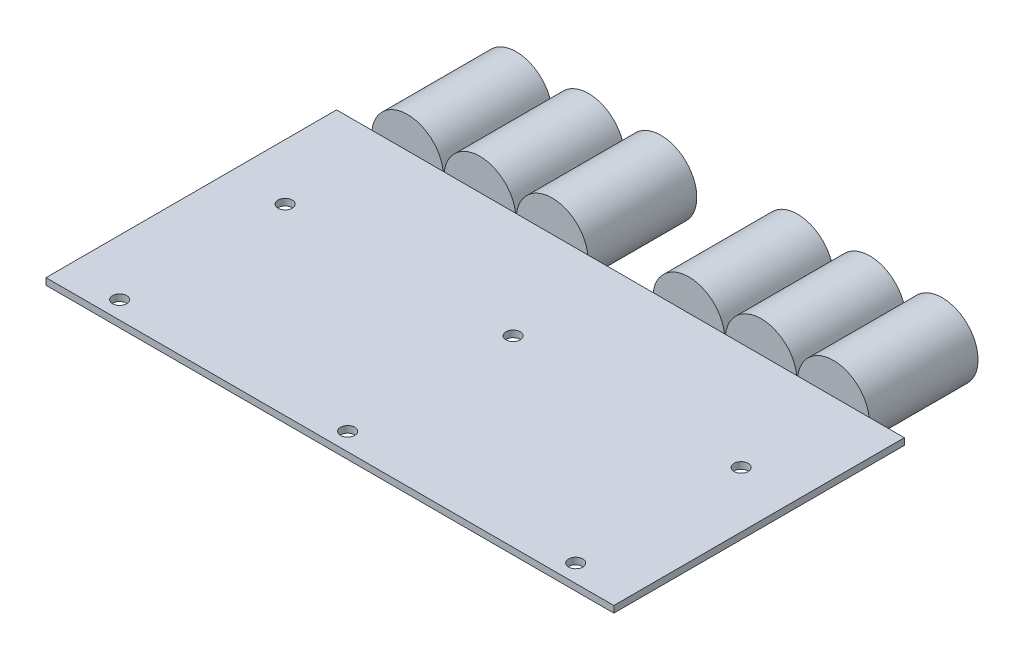
ISO-10303-21;
HEADER;
FILE_DESCRIPTION(('STEP AP214'),'2;1');
FILE_NAME('part.step','',(''),(''),'','','');
FILE_SCHEMA(('AUTOMOTIVE_DESIGN { 1 0 10303 214 1 1 1 1 }'));
ENDSEC;
DATA;
#1=APPLICATION_CONTEXT('core data for automotive mechanical design processes');
#2=APPLICATION_PROTOCOL_DEFINITION('international standard','automotive_design',2000,#1);
#3=PRODUCT_CONTEXT('',#1,'mechanical');
#4=PRODUCT('Part','Part','',(#3));
#5=PRODUCT_RELATED_PRODUCT_CATEGORY('part','',(#4));
#6=PRODUCT_DEFINITION_FORMATION('','',#4);
#7=PRODUCT_DEFINITION_CONTEXT('part definition',#1,'design');
#8=PRODUCT_DEFINITION('design','',#6,#7);
#9=PRODUCT_DEFINITION_SHAPE('','',#8);
#10=(LENGTH_UNIT() NAMED_UNIT(*) SI_UNIT(.MILLI.,.METRE.));
#11=(NAMED_UNIT(*) PLANE_ANGLE_UNIT() SI_UNIT($,.RADIAN.));
#12=(NAMED_UNIT(*) SI_UNIT($,.STERADIAN.) SOLID_ANGLE_UNIT());
#13=UNCERTAINTY_MEASURE_WITH_UNIT(LENGTH_MEASURE(1.E-05),#10,'distance_accuracy_value','');
#14=(GEOMETRIC_REPRESENTATION_CONTEXT(3) GLOBAL_UNCERTAINTY_ASSIGNED_CONTEXT((#13)) GLOBAL_UNIT_ASSIGNED_CONTEXT((#10,
#11,#12)) REPRESENTATION_CONTEXT('',''));
#15=CARTESIAN_POINT('',(0.,0.,0.));
#16=DIRECTION('',(0.,0.,1.));
#17=DIRECTION('',(1.,0.,0.));
#18=AXIS2_PLACEMENT_3D('',#15,#16,#17);
#19=CARTESIAN_POINT('',(64.,1.5,-32.75));
#20=DIRECTION('',(0.,0.,1.));
#21=DIRECTION('',(1.,0.,0.));
#22=AXIS2_PLACEMENT_3D('',#19,#20,#21);
#23=PLANE('',#22);
#24=CARTESIAN_POINT('',(-48.,0.500000000000001,-32.75));
#25=DIRECTION('',(0.,0.,-1.));
#26=DIRECTION('',(1.,0.,0.));
#27=AXIS2_PLACEMENT_3D('',#24,#25,#26);
#28=CIRCLE('',#27,8.1);
#29=CARTESIAN_POINT('',(-56.0845531725631,0.,-32.75));
#30=VERTEX_POINT('',#29);
#31=CARTESIAN_POINT('',(-56.0380345856434,1.5,-32.75));
#32=VERTEX_POINT('',#31);
#33=EDGE_CURVE('E55',#30,#32,#28,.T.);
#34=ORIENTED_EDGE('',*,*,#33,.F.);
#35=DIRECTION('',(-1.,0.,0.));
#36=VECTOR('',#35,1.);
#37=CARTESIAN_POINT('',(64.,0.,-32.75));
#38=LINE('',#37,#36);
#39=CARTESIAN_POINT('',(-64.,0.,-32.75));
#40=VERTEX_POINT('',#39);
#41=EDGE_CURVE('E203',#30,#40,#38,.T.);
#42=ORIENTED_EDGE('',*,*,#41,.T.);
#43=DIRECTION('',(0.,-1.,0.));
#44=VECTOR('',#43,1.);
#45=CARTESIAN_POINT('',(-64.,1.5,-32.75));
#46=LINE('',#45,#44);
#47=CARTESIAN_POINT('',(-64.,1.5,-32.75));
#48=VERTEX_POINT('',#47);
#49=EDGE_CURVE('E219',#48,#40,#46,.T.);
#50=ORIENTED_EDGE('',*,*,#49,.F.);
#51=DIRECTION('',(-1.,0.,0.));
#52=VECTOR('',#51,1.);
#53=CARTESIAN_POINT('',(64.,1.5,-32.75));
#54=LINE('',#53,#52);
#55=EDGE_CURVE('E350',#32,#48,#54,.T.);
#56=ORIENTED_EDGE('',*,*,#55,.F.);
#57=EDGE_LOOP('',(#34,#42,#50,#56));
#58=FACE_BOUND('',#57,.T.);
#59=ADVANCED_FACE('F37',(#58),#23,.F.);
#60=CARTESIAN_POINT('',(-39.9619654143566,1.5,-32.75));
#61=VERTEX_POINT('',#60);
#62=CARTESIAN_POINT('',(-39.9154468274369,0.,-32.75));
#63=VERTEX_POINT('',#62);
#64=EDGE_CURVE('E179',#61,#63,#28,.T.);
#65=ORIENTED_EDGE('',*,*,#64,.F.);
#66=CARTESIAN_POINT('',(-39.7380345856434,1.5,-32.75));
#67=VERTEX_POINT('',#66);
#68=EDGE_CURVE('E401',#67,#61,#54,.T.);
#69=ORIENTED_EDGE('',*,*,#68,.F.);
#70=CARTESIAN_POINT('',(-31.7,0.500000000000001,-32.75));
#71=DIRECTION('',(0.,0.,-1.));
#72=DIRECTION('',(1.,0.,0.));
#73=AXIS2_PLACEMENT_3D('',#70,#71,#72);
#74=CIRCLE('',#73,8.1);
#75=CARTESIAN_POINT('',(-39.7845531725631,0.,-32.75));
#76=VERTEX_POINT('',#75);
#77=EDGE_CURVE('E63',#76,#67,#74,.T.);
#78=ORIENTED_EDGE('',*,*,#77,.F.);
#79=EDGE_CURVE('E202',#76,#63,#38,.T.);
#80=ORIENTED_EDGE('',*,*,#79,.T.);
#81=EDGE_LOOP('',(#65,#69,#78,#80));
#82=FACE_BOUND('',#81,.T.);
#83=ADVANCED_FACE('F206',(#82),#23,.F.);
#84=CARTESIAN_POINT('',(-23.6619654143566,1.5,-32.75));
#85=VERTEX_POINT('',#84);
#86=CARTESIAN_POINT('',(-23.6154468274369,0.,-32.75));
#87=VERTEX_POINT('',#86);
#88=EDGE_CURVE('E204',#85,#87,#74,.T.);
#89=ORIENTED_EDGE('',*,*,#88,.F.);
#90=CARTESIAN_POINT('',(-23.4380345856434,1.5,-32.75));
#91=VERTEX_POINT('',#90);
#92=EDGE_CURVE('E391',#91,#85,#54,.T.);
#93=ORIENTED_EDGE('',*,*,#92,.F.);
#94=CARTESIAN_POINT('',(-15.4,0.500000000000001,-32.75));
#95=DIRECTION('',(0.,0.,-1.));
#96=DIRECTION('',(1.,0.,0.));
#97=AXIS2_PLACEMENT_3D('',#94,#95,#96);
#98=CIRCLE('',#97,8.1);
#99=CARTESIAN_POINT('',(-23.4845531725631,0.,-32.75));
#100=VERTEX_POINT('',#99);
#101=EDGE_CURVE('E280',#100,#91,#98,.T.);
#102=ORIENTED_EDGE('',*,*,#101,.F.);
#103=EDGE_CURVE('E207',#100,#87,#38,.T.);
#104=ORIENTED_EDGE('',*,*,#103,.T.);
#105=EDGE_LOOP('',(#89,#93,#102,#104));
#106=FACE_BOUND('',#105,.T.);
#107=ADVANCED_FACE('F311',(#106),#23,.F.);
#108=CARTESIAN_POINT('',(-7.36196541435657,1.5,-32.75));
#109=VERTEX_POINT('',#108);
#110=CARTESIAN_POINT('',(-7.31544682743691,0.,-32.75));
#111=VERTEX_POINT('',#110);
#112=EDGE_CURVE('E281',#109,#111,#98,.T.);
#113=ORIENTED_EDGE('',*,*,#112,.F.);
#114=CARTESIAN_POINT('',(7.36196541435656,1.5,-32.75));
#115=VERTEX_POINT('',#114);
#116=EDGE_CURVE('E397',#115,#109,#54,.T.);
#117=ORIENTED_EDGE('',*,*,#116,.F.);
#118=CARTESIAN_POINT('',(15.4,0.500000000000001,-32.75));
#119=DIRECTION('',(0.,0.,-1.));
#120=DIRECTION('',(-1.,0.,0.));
#121=AXIS2_PLACEMENT_3D('',#118,#119,#120);
#122=CIRCLE('',#121,8.1);
#123=CARTESIAN_POINT('',(7.3154468274369,0.,-32.75));
#124=VERTEX_POINT('',#123);
#125=EDGE_CURVE('E271',#124,#115,#122,.T.);
#126=ORIENTED_EDGE('',*,*,#125,.F.);
#127=EDGE_CURVE('E210',#124,#111,#38,.T.);
#128=ORIENTED_EDGE('',*,*,#127,.T.);
#129=EDGE_LOOP('',(#113,#117,#126,#128));
#130=FACE_BOUND('',#129,.T.);
#131=ADVANCED_FACE('F336',(#130),#23,.F.);
#132=CARTESIAN_POINT('',(23.4380345856434,1.5,-32.75));
#133=VERTEX_POINT('',#132);
#134=CARTESIAN_POINT('',(23.4845531725631,0.,-32.75));
#135=VERTEX_POINT('',#134);
#136=EDGE_CURVE('E270',#133,#135,#122,.T.);
#137=ORIENTED_EDGE('',*,*,#136,.F.);
#138=CARTESIAN_POINT('',(23.6619654143566,1.5,-32.75));
#139=VERTEX_POINT('',#138);
#140=EDGE_CURVE('E851',#139,#133,#54,.T.);
#141=ORIENTED_EDGE('',*,*,#140,.F.);
#142=CARTESIAN_POINT('',(31.7,0.500000000000001,-32.75));
#143=DIRECTION('',(0.,0.,-1.));
#144=DIRECTION('',(-1.,0.,0.));
#145=AXIS2_PLACEMENT_3D('',#142,#143,#144);
#146=CIRCLE('',#145,8.1);
#147=CARTESIAN_POINT('',(23.6154468274369,0.,-32.75));
#148=VERTEX_POINT('',#147);
#149=EDGE_CURVE('E260',#148,#139,#146,.T.);
#150=ORIENTED_EDGE('',*,*,#149,.F.);
#151=EDGE_CURVE('E364',#148,#135,#38,.T.);
#152=ORIENTED_EDGE('',*,*,#151,.T.);
#153=EDGE_LOOP('',(#137,#141,#150,#152));
#154=FACE_BOUND('',#153,.T.);
#155=ADVANCED_FACE('F329',(#154),#23,.F.);
#156=CARTESIAN_POINT('',(48.,0.500000000000001,-32.75));
#157=DIRECTION('',(0.,0.,-1.));
#158=DIRECTION('',(-1.,0.,0.));
#159=AXIS2_PLACEMENT_3D('',#156,#157,#158);
#160=CIRCLE('',#159,8.1);
#161=CARTESIAN_POINT('',(56.0380345856434,1.5,-32.75));
#162=VERTEX_POINT('',#161);
#163=CARTESIAN_POINT('',(56.0845531725631,0.,-32.75));
#164=VERTEX_POINT('',#163);
#165=EDGE_CURVE('E12',#162,#164,#160,.T.);
#166=ORIENTED_EDGE('',*,*,#165,.F.);
#167=CARTESIAN_POINT('',(64.,1.5,-32.75));
#168=VERTEX_POINT('',#167);
#169=EDGE_CURVE('E223',#168,#162,#54,.T.);
#170=ORIENTED_EDGE('',*,*,#169,.F.);
#171=DIRECTION('',(0.,-1.,0.));
#172=VECTOR('',#171,1.);
#173=CARTESIAN_POINT('',(64.,1.5,-32.75));
#174=LINE('',#173,#172);
#175=CARTESIAN_POINT('',(64.,0.,-32.75));
#176=VERTEX_POINT('',#175);
#177=EDGE_CURVE('E222',#168,#176,#174,.T.);
#178=ORIENTED_EDGE('',*,*,#177,.T.);
#179=EDGE_CURVE('E212',#176,#164,#38,.T.);
#180=ORIENTED_EDGE('',*,*,#179,.T.);
#181=EDGE_LOOP('',(#166,#170,#178,#180));
#182=FACE_BOUND('',#181,.T.);
#183=ADVANCED_FACE('F318',(#182),#23,.F.);
#184=CARTESIAN_POINT('',(0.,0.,0.));
#185=DIRECTION('',(0.,-1.,0.));
#186=DIRECTION('',(0.,0.,-1.));
#187=AXIS2_PLACEMENT_3D('',#184,#185,#186);
#188=PLANE('',#187);
#189=CARTESIAN_POINT('',(0.,0.,28.75));
#190=DIRECTION('',(0.,1.,0.));
#191=DIRECTION('',(0.,0.,1.));
#192=AXIS2_PLACEMENT_3D('',#189,#190,#191);
#193=CIRCLE('',#192,1.6);
#194=CARTESIAN_POINT('',(0.,0.,30.35));
#195=VERTEX_POINT('',#194);
#196=EDGE_CURVE('E434',#195,#195,#193,.T.);
#197=ORIENTED_EDGE('',*,*,#196,.T.);
#198=EDGE_LOOP('',(#197));
#199=FACE_BOUND('',#198,.T.);
#200=CARTESIAN_POINT('',(51.4,0.,28.75));
#201=DIRECTION('',(0.,1.,0.));
#202=DIRECTION('',(0.,0.,1.));
#203=AXIS2_PLACEMENT_3D('',#200,#201,#202);
#204=CIRCLE('',#203,1.6);
#205=CARTESIAN_POINT('',(51.4,0.,30.35));
#206=VERTEX_POINT('',#205);
#207=EDGE_CURVE('E428',#206,#206,#204,.T.);
#208=ORIENTED_EDGE('',*,*,#207,.T.);
#209=EDGE_LOOP('',(#208));
#210=FACE_BOUND('',#209,.T.);
#211=CARTESIAN_POINT('',(-51.4,0.,-8.54999999999998));
#212=DIRECTION('',(0.,1.,0.));
#213=DIRECTION('',(0.,0.,1.));
#214=AXIS2_PLACEMENT_3D('',#211,#212,#213);
#215=CIRCLE('',#214,1.6);
#216=CARTESIAN_POINT('',(-51.4,0.,-6.94999999999998));
#217=VERTEX_POINT('',#216);
#218=EDGE_CURVE('E422',#217,#217,#215,.T.);
#219=ORIENTED_EDGE('',*,*,#218,.T.);
#220=EDGE_LOOP('',(#219));
#221=FACE_BOUND('',#220,.T.);
#222=CARTESIAN_POINT('',(0.,0.,-8.54999999999998));
#223=DIRECTION('',(0.,1.,0.));
#224=DIRECTION('',(0.,0.,1.));
#225=AXIS2_PLACEMENT_3D('',#222,#223,#224);
#226=CIRCLE('',#225,1.6);
#227=CARTESIAN_POINT('',(0.,0.,-6.94999999999998));
#228=VERTEX_POINT('',#227);
#229=EDGE_CURVE('E415',#228,#228,#226,.T.);
#230=ORIENTED_EDGE('',*,*,#229,.T.);
#231=EDGE_LOOP('',(#230));
#232=FACE_BOUND('',#231,.T.);
#233=CARTESIAN_POINT('',(51.4,0.,-8.54999999999999));
#234=DIRECTION('',(0.,1.,0.));
#235=DIRECTION('',(0.,0.,1.));
#236=AXIS2_PLACEMENT_3D('',#233,#234,#235);
#237=CIRCLE('',#236,1.6);
#238=CARTESIAN_POINT('',(51.4,0.,-6.94999999999999));
#239=VERTEX_POINT('',#238);
#240=EDGE_CURVE('E439',#239,#239,#237,.T.);
#241=ORIENTED_EDGE('',*,*,#240,.T.);
#242=EDGE_LOOP('',(#241));
#243=FACE_BOUND('',#242,.T.);
#244=CARTESIAN_POINT('',(-51.4,0.,28.75));
#245=DIRECTION('',(0.,1.,0.));
#246=DIRECTION('',(0.,0.,1.));
#247=AXIS2_PLACEMENT_3D('',#244,#245,#246);
#248=CIRCLE('',#247,1.6);
#249=CARTESIAN_POINT('',(-51.4,0.,30.35));
#250=VERTEX_POINT('',#249);
#251=EDGE_CURVE('E409',#250,#250,#248,.T.);
#252=ORIENTED_EDGE('',*,*,#251,.T.);
#253=EDGE_LOOP('',(#252));
#254=FACE_BOUND('',#253,.T.);
#255=DIRECTION('',(0.,0.,1.));
#256=VECTOR('',#255,1.);
#257=CARTESIAN_POINT('',(-64.,0.,-32.75));
#258=LINE('',#257,#256);
#259=CARTESIAN_POINT('',(-64.,0.,32.75));
#260=VERTEX_POINT('',#259);
#261=EDGE_CURVE('E358',#40,#260,#258,.T.);
#262=ORIENTED_EDGE('',*,*,#261,.F.);
#263=ORIENTED_EDGE('',*,*,#41,.F.);
#264=DIRECTION('',(-1.,0.,0.));
#265=VECTOR('',#264,1.);
#266=CARTESIAN_POINT('',(0.,0.,-32.75));
#267=LINE('',#266,#265);
#268=EDGE_CURVE('E193',#63,#30,#267,.T.);
#269=ORIENTED_EDGE('',*,*,#268,.F.);
#270=ORIENTED_EDGE('',*,*,#79,.F.);
#271=DIRECTION('',(-1.,0.,0.));
#272=VECTOR('',#271,1.);
#273=CARTESIAN_POINT('',(0.,0.,-32.75));
#274=LINE('',#273,#272);
#275=EDGE_CURVE('E282',#87,#76,#274,.T.);
#276=ORIENTED_EDGE('',*,*,#275,.F.);
#277=ORIENTED_EDGE('',*,*,#103,.F.);
#278=DIRECTION('',(-1.,0.,0.));
#279=VECTOR('',#278,1.);
#280=CARTESIAN_POINT('',(0.,0.,-32.75));
#281=LINE('',#280,#279);
#282=EDGE_CURVE('E272',#111,#100,#281,.T.);
#283=ORIENTED_EDGE('',*,*,#282,.F.);
#284=ORIENTED_EDGE('',*,*,#127,.F.);
#285=DIRECTION('',(1.,0.,0.));
#286=VECTOR('',#285,1.);
#287=CARTESIAN_POINT('',(0.,0.,-32.75));
#288=LINE('',#287,#286);
#289=EDGE_CURVE('E261',#124,#135,#288,.T.);
#290=ORIENTED_EDGE('',*,*,#289,.T.);
#291=ORIENTED_EDGE('',*,*,#151,.F.);
#292=DIRECTION('',(1.,0.,0.));
#293=VECTOR('',#292,1.);
#294=CARTESIAN_POINT('',(0.,0.,-32.75));
#295=LINE('',#294,#293);
#296=CARTESIAN_POINT('',(39.7845531725631,0.,-32.75));
#297=VERTEX_POINT('',#296);
#298=EDGE_CURVE('E246',#148,#297,#295,.T.);
#299=ORIENTED_EDGE('',*,*,#298,.T.);
#300=CARTESIAN_POINT('',(39.9154468274369,0.,-32.75));
#301=VERTEX_POINT('',#300);
#302=EDGE_CURVE('E362',#301,#297,#38,.T.);
#303=ORIENTED_EDGE('',*,*,#302,.F.);
#304=EDGE_CURVE('E217',#164,#301,#38,.T.);
#305=ORIENTED_EDGE('',*,*,#304,.F.);
#306=ORIENTED_EDGE('',*,*,#179,.F.);
#307=DIRECTION('',(0.,0.,-1.));
#308=VECTOR('',#307,1.);
#309=CARTESIAN_POINT('',(64.,0.,-32.75));
#310=LINE('',#309,#308);
#311=CARTESIAN_POINT('',(64.,0.,32.75));
#312=VERTEX_POINT('',#311);
#313=EDGE_CURVE('E211',#312,#176,#310,.T.);
#314=ORIENTED_EDGE('',*,*,#313,.F.);
#315=DIRECTION('',(1.,0.,0.));
#316=VECTOR('',#315,1.);
#317=CARTESIAN_POINT('',(64.,0.,32.75));
#318=LINE('',#317,#316);
#319=EDGE_CURVE('E359',#260,#312,#318,.T.);
#320=ORIENTED_EDGE('',*,*,#319,.F.);
#321=EDGE_LOOP('',(#262,#263,#269,#270,#276,#277,#283,#284,#290,#291,#299,#303,#305,#306,#314,#320));
#322=FACE_BOUND('',#321,.T.);
#323=DIRECTION('',(1.,0.,0.));
#324=VECTOR('',#323,1.);
#325=CARTESIAN_POINT('',(52.5,0.,1.75000000000002));
#326=LINE('',#325,#324);
#327=CARTESIAN_POINT('',(-52.5,0.,1.75000000000001));
#328=VERTEX_POINT('',#327);
#329=CARTESIAN_POINT('',(52.5,0.,1.75000000000002));
#330=VERTEX_POINT('',#329);
#331=EDGE_CURVE('E461',#328,#330,#326,.T.);
#332=ORIENTED_EDGE('',*,*,#331,.F.);
#333=DIRECTION('',(0.,0.,-1.));
#334=VECTOR('',#333,1.);
#335=CARTESIAN_POINT('',(-52.5,0.,1.75000000000001));
#336=LINE('',#335,#334);
#337=CARTESIAN_POINT('',(-52.5,0.,19.75));
#338=VERTEX_POINT('',#337);
#339=EDGE_CURVE('E245',#338,#328,#336,.T.);
#340=ORIENTED_EDGE('',*,*,#339,.F.);
#341=DIRECTION('',(-1.,0.,0.));
#342=VECTOR('',#341,1.);
#343=CARTESIAN_POINT('',(52.5,0.,19.75));
#344=LINE('',#343,#342);
#345=CARTESIAN_POINT('',(52.5,0.,19.75));
#346=VERTEX_POINT('',#345);
#347=EDGE_CURVE('E455',#346,#338,#344,.T.);
#348=ORIENTED_EDGE('',*,*,#347,.F.);
#349=DIRECTION('',(0.,0.,1.));
#350=VECTOR('',#349,1.);
#351=CARTESIAN_POINT('',(52.5,0.,1.75000000000002));
#352=LINE('',#351,#350);
#353=EDGE_CURVE('E458',#330,#346,#352,.T.);
#354=ORIENTED_EDGE('',*,*,#353,.F.);
#355=EDGE_LOOP('',(#332,#340,#348,#354));
#356=FACE_BOUND('',#355,.T.);
#357=ADVANCED_FACE('F199',(#199,#210,#221,#232,#243,#254,#322,#356),#188,.T.);
#358=CARTESIAN_POINT('',(-64.,1.5,-32.75));
#359=DIRECTION('',(1.,0.,0.));
#360=DIRECTION('',(0.,0.,-1.));
#361=AXIS2_PLACEMENT_3D('',#358,#359,#360);
#362=PLANE('',#361);
#363=ORIENTED_EDGE('',*,*,#261,.T.);
#364=DIRECTION('',(0.,-1.,0.));
#365=VECTOR('',#364,1.);
#366=CARTESIAN_POINT('',(-64.,1.5,32.75));
#367=LINE('',#366,#365);
#368=CARTESIAN_POINT('',(-64.,1.5,32.75));
#369=VERTEX_POINT('',#368);
#370=EDGE_CURVE('E41',#369,#260,#367,.T.);
#371=ORIENTED_EDGE('',*,*,#370,.F.);
#372=DIRECTION('',(0.,0.,1.));
#373=VECTOR('',#372,1.);
#374=CARTESIAN_POINT('',(-64.,1.5,-32.75));
#375=LINE('',#374,#373);
#376=EDGE_CURVE('E216',#48,#369,#375,.T.);
#377=ORIENTED_EDGE('',*,*,#376,.F.);
#378=ORIENTED_EDGE('',*,*,#49,.T.);
#379=EDGE_LOOP('',(#363,#371,#377,#378));
#380=FACE_BOUND('',#379,.T.);
#381=ADVANCED_FACE('F39',(#380),#362,.F.);
#382=CARTESIAN_POINT('',(64.,1.5,32.75));
#383=DIRECTION('',(0.,0.,-1.));
#384=DIRECTION('',(-1.,0.,0.));
#385=AXIS2_PLACEMENT_3D('',#382,#383,#384);
#386=PLANE('',#385);
#387=ORIENTED_EDGE('',*,*,#319,.T.);
#388=DIRECTION('',(0.,-1.,0.));
#389=VECTOR('',#388,1.);
#390=CARTESIAN_POINT('',(64.,1.5,32.75));
#391=LINE('',#390,#389);
#392=CARTESIAN_POINT('',(64.,1.5,32.75));
#393=VERTEX_POINT('',#392);
#394=EDGE_CURVE('E225',#393,#312,#391,.T.);
#395=ORIENTED_EDGE('',*,*,#394,.F.);
#396=DIRECTION('',(1.,0.,0.));
#397=VECTOR('',#396,1.);
#398=CARTESIAN_POINT('',(64.,1.5,32.75));
#399=LINE('',#398,#397);
#400=EDGE_CURVE('E406',#369,#393,#399,.T.);
#401=ORIENTED_EDGE('',*,*,#400,.F.);
#402=ORIENTED_EDGE('',*,*,#370,.T.);
#403=EDGE_LOOP('',(#387,#395,#401,#402));
#404=FACE_BOUND('',#403,.T.);
#405=ADVANCED_FACE('F326',(#404),#386,.F.);
#406=CARTESIAN_POINT('',(64.,1.5,-32.75));
#407=DIRECTION('',(-1.,0.,0.));
#408=DIRECTION('',(0.,0.,1.));
#409=AXIS2_PLACEMENT_3D('',#406,#407,#408);
#410=PLANE('',#409);
#411=ORIENTED_EDGE('',*,*,#313,.T.);
#412=ORIENTED_EDGE('',*,*,#177,.F.);
#413=DIRECTION('',(0.,0.,-1.));
#414=VECTOR('',#413,1.);
#415=CARTESIAN_POINT('',(64.,1.5,-32.75));
#416=LINE('',#415,#414);
#417=EDGE_CURVE('E347',#393,#168,#416,.T.);
#418=ORIENTED_EDGE('',*,*,#417,.F.);
#419=ORIENTED_EDGE('',*,*,#394,.T.);
#420=EDGE_LOOP('',(#411,#412,#418,#419));
#421=FACE_BOUND('',#420,.T.);
#422=ADVANCED_FACE('F316',(#421),#410,.F.);
#423=CARTESIAN_POINT('',(39.7380345856434,1.5,-32.75));
#424=VERTEX_POINT('',#423);
#425=EDGE_CURVE('E259',#424,#297,#146,.T.);
#426=ORIENTED_EDGE('',*,*,#425,.F.);
#427=CARTESIAN_POINT('',(39.9619654143566,1.5,-32.75));
#428=VERTEX_POINT('',#427);
#429=EDGE_CURVE('E353',#428,#424,#54,.T.);
#430=ORIENTED_EDGE('',*,*,#429,.F.);
#431=EDGE_CURVE('E46',#301,#428,#160,.T.);
#432=ORIENTED_EDGE('',*,*,#431,.F.);
#433=ORIENTED_EDGE('',*,*,#302,.T.);
#434=EDGE_LOOP('',(#426,#430,#432,#433));
#435=FACE_BOUND('',#434,.T.);
#436=ADVANCED_FACE('F307',(#435),#23,.F.);
#437=CARTESIAN_POINT('',(0.,1.5,0.));
#438=DIRECTION('',(0.,-1.,0.));
#439=DIRECTION('',(0.,0.,-1.));
#440=AXIS2_PLACEMENT_3D('',#437,#438,#439);
#441=PLANE('',#440);
#442=CARTESIAN_POINT('',(0.,1.5,28.75));
#443=DIRECTION('',(0.,1.,0.));
#444=DIRECTION('',(0.,0.,1.));
#445=AXIS2_PLACEMENT_3D('',#442,#443,#444);
#446=CIRCLE('',#445,1.6);
#447=CARTESIAN_POINT('',(0.,1.5,30.35));
#448=VERTEX_POINT('',#447);
#449=EDGE_CURVE('E412',#448,#448,#446,.T.);
#450=ORIENTED_EDGE('',*,*,#449,.F.);
#451=EDGE_LOOP('',(#450));
#452=FACE_BOUND('',#451,.T.);
#453=CARTESIAN_POINT('',(51.4,1.5,28.75));
#454=DIRECTION('',(0.,1.,0.));
#455=DIRECTION('',(0.,0.,1.));
#456=AXIS2_PLACEMENT_3D('',#453,#454,#455);
#457=CIRCLE('',#456,1.6);
#458=CARTESIAN_POINT('',(51.4,1.5,30.35));
#459=VERTEX_POINT('',#458);
#460=EDGE_CURVE('E431',#459,#459,#457,.T.);
#461=ORIENTED_EDGE('',*,*,#460,.F.);
#462=EDGE_LOOP('',(#461));
#463=FACE_BOUND('',#462,.T.);
#464=CARTESIAN_POINT('',(-51.4,1.5,-8.54999999999998));
#465=DIRECTION('',(0.,1.,0.));
#466=DIRECTION('',(0.,0.,1.));
#467=AXIS2_PLACEMENT_3D('',#464,#465,#466);
#468=CIRCLE('',#467,1.6);
#469=CARTESIAN_POINT('',(-51.4,1.5,-6.94999999999998));
#470=VERTEX_POINT('',#469);
#471=EDGE_CURVE('E425',#470,#470,#468,.T.);
#472=ORIENTED_EDGE('',*,*,#471,.F.);
#473=EDGE_LOOP('',(#472));
#474=FACE_BOUND('',#473,.T.);
#475=CARTESIAN_POINT('',(0.,1.5,-8.54999999999998));
#476=DIRECTION('',(0.,1.,0.));
#477=DIRECTION('',(0.,0.,1.));
#478=AXIS2_PLACEMENT_3D('',#475,#476,#477);
#479=CIRCLE('',#478,1.6);
#480=CARTESIAN_POINT('',(0.,1.5,-6.94999999999998));
#481=VERTEX_POINT('',#480);
#482=EDGE_CURVE('E418',#481,#481,#479,.T.);
#483=ORIENTED_EDGE('',*,*,#482,.F.);
#484=EDGE_LOOP('',(#483));
#485=FACE_BOUND('',#484,.T.);
#486=CARTESIAN_POINT('',(51.4,1.5,-8.54999999999999));
#487=DIRECTION('',(0.,1.,0.));
#488=DIRECTION('',(0.,0.,1.));
#489=AXIS2_PLACEMENT_3D('',#486,#487,#488);
#490=CIRCLE('',#489,1.6);
#491=CARTESIAN_POINT('',(51.4,1.5,-6.94999999999999));
#492=VERTEX_POINT('',#491);
#493=EDGE_CURVE('E419',#492,#492,#490,.T.);
#494=ORIENTED_EDGE('',*,*,#493,.F.);
#495=EDGE_LOOP('',(#494));
#496=FACE_BOUND('',#495,.T.);
#497=CARTESIAN_POINT('',(-51.4,1.5,28.75));
#498=DIRECTION('',(0.,1.,0.));
#499=DIRECTION('',(0.,0.,1.));
#500=AXIS2_PLACEMENT_3D('',#497,#498,#499);
#501=CIRCLE('',#500,1.6);
#502=CARTESIAN_POINT('',(-51.4,1.5,30.35));
#503=VERTEX_POINT('',#502);
#504=EDGE_CURVE('E360',#503,#503,#501,.T.);
#505=ORIENTED_EDGE('',*,*,#504,.F.);
#506=EDGE_LOOP('',(#505));
#507=FACE_BOUND('',#506,.T.);
#508=ORIENTED_EDGE('',*,*,#376,.T.);
#509=ORIENTED_EDGE('',*,*,#400,.T.);
#510=ORIENTED_EDGE('',*,*,#417,.T.);
#511=ORIENTED_EDGE('',*,*,#169,.T.);
#512=EDGE_CURVE('E345',#162,#428,#54,.T.);
#513=ORIENTED_EDGE('',*,*,#512,.T.);
#514=ORIENTED_EDGE('',*,*,#429,.T.);
#515=EDGE_CURVE('E354',#424,#139,#54,.T.);
#516=ORIENTED_EDGE('',*,*,#515,.T.);
#517=ORIENTED_EDGE('',*,*,#140,.T.);
#518=EDGE_CURVE('E398',#133,#115,#54,.T.);
#519=ORIENTED_EDGE('',*,*,#518,.T.);
#520=ORIENTED_EDGE('',*,*,#116,.T.);
#521=EDGE_CURVE('E396',#109,#91,#54,.T.);
#522=ORIENTED_EDGE('',*,*,#521,.T.);
#523=ORIENTED_EDGE('',*,*,#92,.T.);
#524=EDGE_CURVE('E399',#85,#67,#54,.T.);
#525=ORIENTED_EDGE('',*,*,#524,.T.);
#526=ORIENTED_EDGE('',*,*,#68,.T.);
#527=EDGE_CURVE('E402',#61,#32,#54,.T.);
#528=ORIENTED_EDGE('',*,*,#527,.T.);
#529=ORIENTED_EDGE('',*,*,#55,.T.);
#530=EDGE_LOOP('',(#508,#509,#510,#511,#513,#514,#516,#517,#519,#520,#522,#523,#525,#526,#528,#529));
#531=FACE_BOUND('',#530,.T.);
#532=ADVANCED_FACE('F315',(#452,#463,#474,#485,#496,#507,#531),#441,.F.);
#533=CARTESIAN_POINT('',(-51.4,1.5,28.75));
#534=DIRECTION('',(0.,-1.,0.));
#535=DIRECTION('',(0.,0.,-1.));
#536=AXIS2_PLACEMENT_3D('',#533,#534,#535);
#537=CYLINDRICAL_SURFACE('',#536,1.6);
#538=ORIENTED_EDGE('',*,*,#504,.T.);
#539=EDGE_LOOP('',(#538));
#540=FACE_BOUND('',#539,.T.);
#541=ORIENTED_EDGE('',*,*,#251,.F.);
#542=EDGE_LOOP('',(#541));
#543=FACE_BOUND('',#542,.T.);
#544=ADVANCED_FACE('F323',(#540,#543),#537,.F.);
#545=CARTESIAN_POINT('',(51.4,1.5,-8.54999999999999));
#546=DIRECTION('',(0.,-1.,0.));
#547=DIRECTION('',(0.,0.,-1.));
#548=AXIS2_PLACEMENT_3D('',#545,#546,#547);
#549=CYLINDRICAL_SURFACE('',#548,1.6);
#550=ORIENTED_EDGE('',*,*,#493,.T.);
#551=EDGE_LOOP('',(#550));
#552=FACE_BOUND('',#551,.T.);
#553=ORIENTED_EDGE('',*,*,#240,.F.);
#554=EDGE_LOOP('',(#553));
#555=FACE_BOUND('',#554,.T.);
#556=ADVANCED_FACE('F508',(#552,#555),#549,.F.);
#557=CARTESIAN_POINT('',(0.,1.5,-8.54999999999998));
#558=DIRECTION('',(0.,-1.,0.));
#559=DIRECTION('',(0.,0.,-1.));
#560=AXIS2_PLACEMENT_3D('',#557,#558,#559);
#561=CYLINDRICAL_SURFACE('',#560,1.6);
#562=ORIENTED_EDGE('',*,*,#482,.T.);
#563=EDGE_LOOP('',(#562));
#564=FACE_BOUND('',#563,.T.);
#565=ORIENTED_EDGE('',*,*,#229,.F.);
#566=EDGE_LOOP('',(#565));
#567=FACE_BOUND('',#566,.T.);
#568=ADVANCED_FACE('F511',(#564,#567),#561,.F.);
#569=CARTESIAN_POINT('',(-51.4,1.5,-8.54999999999998));
#570=DIRECTION('',(0.,-1.,0.));
#571=DIRECTION('',(0.,0.,-1.));
#572=AXIS2_PLACEMENT_3D('',#569,#570,#571);
#573=CYLINDRICAL_SURFACE('',#572,1.6);
#574=ORIENTED_EDGE('',*,*,#471,.T.);
#575=EDGE_LOOP('',(#574));
#576=FACE_BOUND('',#575,.T.);
#577=ORIENTED_EDGE('',*,*,#218,.F.);
#578=EDGE_LOOP('',(#577));
#579=FACE_BOUND('',#578,.T.);
#580=ADVANCED_FACE('F519',(#576,#579),#573,.F.);
#581=CARTESIAN_POINT('',(51.4,1.5,28.75));
#582=DIRECTION('',(0.,-1.,0.));
#583=DIRECTION('',(0.,0.,-1.));
#584=AXIS2_PLACEMENT_3D('',#581,#582,#583);
#585=CYLINDRICAL_SURFACE('',#584,1.6);
#586=ORIENTED_EDGE('',*,*,#460,.T.);
#587=EDGE_LOOP('',(#586));
#588=FACE_BOUND('',#587,.T.);
#589=ORIENTED_EDGE('',*,*,#207,.F.);
#590=EDGE_LOOP('',(#589));
#591=FACE_BOUND('',#590,.T.);
#592=ADVANCED_FACE('F515',(#588,#591),#585,.F.);
#593=CARTESIAN_POINT('',(0.,1.5,28.75));
#594=DIRECTION('',(0.,-1.,0.));
#595=DIRECTION('',(0.,0.,-1.));
#596=AXIS2_PLACEMENT_3D('',#593,#594,#595);
#597=CYLINDRICAL_SURFACE('',#596,1.6);
#598=ORIENTED_EDGE('',*,*,#449,.T.);
#599=EDGE_LOOP('',(#598));
#600=FACE_BOUND('',#599,.T.);
#601=ORIENTED_EDGE('',*,*,#196,.F.);
#602=EDGE_LOOP('',(#601));
#603=FACE_BOUND('',#602,.T.);
#604=ADVANCED_FACE('F507',(#600,#603),#597,.F.);
#605=CARTESIAN_POINT('',(-52.5,-1.,1.75000000000001));
#606=DIRECTION('',(1.,0.,0.));
#607=DIRECTION('',(0.,0.,-1.));
#608=AXIS2_PLACEMENT_3D('',#605,#606,#607);
#609=PLANE('',#608);
#610=ORIENTED_EDGE('',*,*,#339,.T.);
#611=DIRECTION('',(0.,1.,0.));
#612=VECTOR('',#611,1.);
#613=CARTESIAN_POINT('',(-52.5,-1.,1.75000000000001));
#614=LINE('',#613,#612);
#615=CARTESIAN_POINT('',(-52.5,-1.,1.75000000000001));
#616=VERTEX_POINT('',#615);
#617=EDGE_CURVE('E442',#616,#328,#614,.T.);
#618=ORIENTED_EDGE('',*,*,#617,.F.);
#619=DIRECTION('',(0.,0.,-1.));
#620=VECTOR('',#619,1.);
#621=CARTESIAN_POINT('',(-52.5,-1.,1.75000000000001));
#622=LINE('',#621,#620);
#623=CARTESIAN_POINT('',(-52.5,-1.,19.75));
#624=VERTEX_POINT('',#623);
#625=EDGE_CURVE('E457',#624,#616,#622,.T.);
#626=ORIENTED_EDGE('',*,*,#625,.F.);
#627=DIRECTION('',(0.,1.,0.));
#628=VECTOR('',#627,1.);
#629=CARTESIAN_POINT('',(-52.5,-1.,19.75));
#630=LINE('',#629,#628);
#631=EDGE_CURVE('E451',#624,#338,#630,.T.);
#632=ORIENTED_EDGE('',*,*,#631,.T.);
#633=EDGE_LOOP('',(#610,#618,#626,#632));
#634=FACE_BOUND('',#633,.T.);
#635=ADVANCED_FACE('F479',(#634),#609,.F.);
#636=CARTESIAN_POINT('',(52.5,-1.,1.75000000000002));
#637=DIRECTION('',(0.,0.,1.));
#638=DIRECTION('',(1.,0.,0.));
#639=AXIS2_PLACEMENT_3D('',#636,#637,#638);
#640=PLANE('',#639);
#641=ORIENTED_EDGE('',*,*,#331,.T.);
#642=DIRECTION('',(0.,1.,0.));
#643=VECTOR('',#642,1.);
#644=CARTESIAN_POINT('',(52.5,-1.,1.75000000000002));
#645=LINE('',#644,#643);
#646=CARTESIAN_POINT('',(52.5,-1.,1.75000000000002));
#647=VERTEX_POINT('',#646);
#648=EDGE_CURVE('E446',#647,#330,#645,.T.);
#649=ORIENTED_EDGE('',*,*,#648,.F.);
#650=DIRECTION('',(1.,0.,0.));
#651=VECTOR('',#650,1.);
#652=CARTESIAN_POINT('',(52.5,-1.,1.75000000000002));
#653=LINE('',#652,#651);
#654=EDGE_CURVE('E468',#616,#647,#653,.T.);
#655=ORIENTED_EDGE('',*,*,#654,.F.);
#656=ORIENTED_EDGE('',*,*,#617,.T.);
#657=EDGE_LOOP('',(#641,#649,#655,#656));
#658=FACE_BOUND('',#657,.T.);
#659=ADVANCED_FACE('F483',(#658),#640,.F.);
#660=CARTESIAN_POINT('',(52.5,-1.,1.75000000000002));
#661=DIRECTION('',(-1.,0.,0.));
#662=DIRECTION('',(0.,0.,1.));
#663=AXIS2_PLACEMENT_3D('',#660,#661,#662);
#664=PLANE('',#663);
#665=ORIENTED_EDGE('',*,*,#353,.T.);
#666=DIRECTION('',(0.,1.,0.));
#667=VECTOR('',#666,1.);
#668=CARTESIAN_POINT('',(52.5,-1.,19.75));
#669=LINE('',#668,#667);
#670=CARTESIAN_POINT('',(52.5,-1.,19.75));
#671=VERTEX_POINT('',#670);
#672=EDGE_CURVE('E449',#671,#346,#669,.T.);
#673=ORIENTED_EDGE('',*,*,#672,.F.);
#674=DIRECTION('',(0.,0.,1.));
#675=VECTOR('',#674,1.);
#676=CARTESIAN_POINT('',(52.5,-1.,1.75000000000002));
#677=LINE('',#676,#675);
#678=EDGE_CURVE('E466',#647,#671,#677,.T.);
#679=ORIENTED_EDGE('',*,*,#678,.F.);
#680=ORIENTED_EDGE('',*,*,#648,.T.);
#681=EDGE_LOOP('',(#665,#673,#679,#680));
#682=FACE_BOUND('',#681,.T.);
#683=ADVANCED_FACE('F488',(#682),#664,.F.);
#684=CARTESIAN_POINT('',(52.5,-1.,19.75));
#685=DIRECTION('',(0.,0.,-1.));
#686=DIRECTION('',(-1.,0.,0.));
#687=AXIS2_PLACEMENT_3D('',#684,#685,#686);
#688=PLANE('',#687);
#689=ORIENTED_EDGE('',*,*,#347,.T.);
#690=ORIENTED_EDGE('',*,*,#631,.F.);
#691=DIRECTION('',(-1.,0.,0.));
#692=VECTOR('',#691,1.);
#693=CARTESIAN_POINT('',(52.5,-1.,19.75));
#694=LINE('',#693,#692);
#695=EDGE_CURVE('E454',#671,#624,#694,.T.);
#696=ORIENTED_EDGE('',*,*,#695,.F.);
#697=ORIENTED_EDGE('',*,*,#672,.T.);
#698=EDGE_LOOP('',(#689,#690,#696,#697));
#699=FACE_BOUND('',#698,.T.);
#700=ADVANCED_FACE('F491',(#699),#688,.F.);
#701=CARTESIAN_POINT('',(0.,-1.,0.));
#702=DIRECTION('',(0.,-1.,0.));
#703=DIRECTION('',(0.,0.,-1.));
#704=AXIS2_PLACEMENT_3D('',#701,#702,#703);
#705=PLANE('',#704);
#706=ORIENTED_EDGE('',*,*,#625,.T.);
#707=ORIENTED_EDGE('',*,*,#654,.T.);
#708=ORIENTED_EDGE('',*,*,#678,.T.);
#709=ORIENTED_EDGE('',*,*,#695,.T.);
#710=EDGE_LOOP('',(#706,#707,#708,#709));
#711=FACE_BOUND('',#710,.T.);
#712=ADVANCED_FACE('F474',(#711),#705,.T.);
#713=CARTESIAN_POINT('',(48.,0.500000000000001,-32.75));
#714=DIRECTION('',(0.,0.,-1.));
#715=DIRECTION('',(-1.,0.,0.));
#716=AXIS2_PLACEMENT_3D('',#713,#714,#715);
#717=PLANE('',#716);
#718=EDGE_CURVE('E48',#164,#301,#160,.T.);
#719=ORIENTED_EDGE('',*,*,#718,.F.);
#720=ORIENTED_EDGE('',*,*,#304,.T.);
#721=EDGE_LOOP('',(#719,#720));
#722=FACE_BOUND('',#721,.T.);
#723=ADVANCED_FACE('F498',(#722),#717,.F.);
#724=CARTESIAN_POINT('',(48.,0.500000000000001,-170.160259710444));
#725=DIRECTION('',(0.,0.,1.));
#726=DIRECTION('',(1.,0.,0.));
#727=AXIS2_PLACEMENT_3D('',#724,#725,#726);
#728=CYLINDRICAL_SURFACE('',#727,8.1);
#729=EDGE_CURVE('E236',#428,#162,#160,.T.);
#730=ORIENTED_EDGE('',*,*,#729,.T.);
#731=ORIENTED_EDGE('',*,*,#165,.T.);
#732=ORIENTED_EDGE('',*,*,#718,.T.);
#733=ORIENTED_EDGE('',*,*,#431,.T.);
#734=EDGE_LOOP('',(#730,#731,#732,#733));
#735=FACE_BOUND('',#734,.T.);
#736=CARTESIAN_POINT('',(48.,0.500000000000001,-57.25));
#737=DIRECTION('',(0.,0.,-1.));
#738=DIRECTION('',(-1.,0.,0.));
#739=AXIS2_PLACEMENT_3D('',#736,#737,#738);
#740=CIRCLE('',#739,8.1);
#741=CARTESIAN_POINT('',(39.9,0.500000000000001,-57.25));
#742=VERTEX_POINT('',#741);
#743=EDGE_CURVE('E243',#742,#742,#740,.T.);
#744=ORIENTED_EDGE('',*,*,#743,.F.);
#745=EDGE_LOOP('',(#744));
#746=FACE_BOUND('',#745,.T.);
#747=ADVANCED_FACE('F640',(#735,#746),#728,.T.);
#748=ORIENTED_EDGE('',*,*,#512,.F.);
#749=ORIENTED_EDGE('',*,*,#729,.F.);
#750=EDGE_LOOP('',(#748,#749));
#751=FACE_BOUND('',#750,.T.);
#752=ADVANCED_FACE('F352',(#751),#717,.F.);
#753=CARTESIAN_POINT('',(64.,1.5,-57.25));
#754=DIRECTION('',(0.,0.,-1.));
#755=DIRECTION('',(-1.,0.,0.));
#756=AXIS2_PLACEMENT_3D('',#753,#754,#755);
#757=PLANE('',#756);
#758=ORIENTED_EDGE('',*,*,#743,.T.);
#759=EDGE_LOOP('',(#758));
#760=FACE_BOUND('',#759,.T.);
#761=ADVANCED_FACE('F657',(#760),#757,.T.);
#762=CARTESIAN_POINT('',(31.7,0.500000000000001,-32.75));
#763=DIRECTION('',(0.,0.,-1.));
#764=DIRECTION('',(-1.,0.,0.));
#765=AXIS2_PLACEMENT_3D('',#762,#763,#764);
#766=PLANE('',#765);
#767=EDGE_CURVE('E254',#139,#424,#146,.T.);
#768=ORIENTED_EDGE('',*,*,#767,.F.);
#769=ORIENTED_EDGE('',*,*,#515,.F.);
#770=EDGE_LOOP('',(#768,#769));
#771=FACE_BOUND('',#770,.T.);
#772=ADVANCED_FACE('F665',(#771),#766,.F.);
#773=CARTESIAN_POINT('',(31.7,0.500000000000001,-170.160259710444));
#774=DIRECTION('',(0.,0.,1.));
#775=DIRECTION('',(1.,0.,0.));
#776=AXIS2_PLACEMENT_3D('',#773,#774,#775);
#777=CYLINDRICAL_SURFACE('',#776,8.1);
#778=ORIENTED_EDGE('',*,*,#767,.T.);
#779=ORIENTED_EDGE('',*,*,#425,.T.);
#780=EDGE_CURVE('E858',#297,#148,#146,.T.);
#781=ORIENTED_EDGE('',*,*,#780,.T.);
#782=ORIENTED_EDGE('',*,*,#149,.T.);
#783=EDGE_LOOP('',(#778,#779,#781,#782));
#784=FACE_BOUND('',#783,.T.);
#785=CARTESIAN_POINT('',(31.7,0.500000000000001,-57.25));
#786=DIRECTION('',(0.,0.,-1.));
#787=DIRECTION('',(-1.,0.,0.));
#788=AXIS2_PLACEMENT_3D('',#785,#786,#787);
#789=CIRCLE('',#788,8.1);
#790=CARTESIAN_POINT('',(23.6,0.500000000000001,-57.25));
#791=VERTEX_POINT('',#790);
#792=EDGE_CURVE('E249',#791,#791,#789,.T.);
#793=ORIENTED_EDGE('',*,*,#792,.F.);
#794=EDGE_LOOP('',(#793));
#795=FACE_BOUND('',#794,.T.);
#796=ADVANCED_FACE('F674',(#784,#795),#777,.T.);
#797=ORIENTED_EDGE('',*,*,#298,.F.);
#798=ORIENTED_EDGE('',*,*,#780,.F.);
#799=EDGE_LOOP('',(#797,#798));
#800=FACE_BOUND('',#799,.T.);
#801=ADVANCED_FACE('F677',(#800),#766,.F.);
#802=CARTESIAN_POINT('',(64.,1.5,-57.25));
#803=DIRECTION('',(0.,0.,-1.));
#804=DIRECTION('',(-1.,0.,0.));
#805=AXIS2_PLACEMENT_3D('',#802,#803,#804);
#806=PLANE('',#805);
#807=ORIENTED_EDGE('',*,*,#792,.T.);
#808=EDGE_LOOP('',(#807));
#809=FACE_BOUND('',#808,.T.);
#810=ADVANCED_FACE('F694',(#809),#806,.T.);
#811=CARTESIAN_POINT('',(15.4,0.500000000000001,-32.75));
#812=DIRECTION('',(0.,0.,-1.));
#813=DIRECTION('',(-1.,0.,0.));
#814=AXIS2_PLACEMENT_3D('',#811,#812,#813);
#815=PLANE('',#814);
#816=EDGE_CURVE('E267',#115,#133,#122,.T.);
#817=ORIENTED_EDGE('',*,*,#816,.F.);
#818=ORIENTED_EDGE('',*,*,#518,.F.);
#819=EDGE_LOOP('',(#817,#818));
#820=FACE_BOUND('',#819,.T.);
#821=ADVANCED_FACE('F703',(#820),#815,.F.);
#822=CARTESIAN_POINT('',(15.4,0.500000000000001,-170.160259710444));
#823=DIRECTION('',(0.,0.,1.));
#824=DIRECTION('',(1.,0.,0.));
#825=AXIS2_PLACEMENT_3D('',#822,#823,#824);
#826=CYLINDRICAL_SURFACE('',#825,8.1);
#827=ORIENTED_EDGE('',*,*,#816,.T.);
#828=ORIENTED_EDGE('',*,*,#136,.T.);
#829=EDGE_CURVE('E847',#135,#124,#122,.T.);
#830=ORIENTED_EDGE('',*,*,#829,.T.);
#831=ORIENTED_EDGE('',*,*,#125,.T.);
#832=EDGE_LOOP('',(#827,#828,#830,#831));
#833=FACE_BOUND('',#832,.T.);
#834=CARTESIAN_POINT('',(15.4,0.500000000000001,-57.25));
#835=DIRECTION('',(0.,0.,-1.));
#836=DIRECTION('',(-1.,0.,0.));
#837=AXIS2_PLACEMENT_3D('',#834,#835,#836);
#838=CIRCLE('',#837,8.1);
#839=CARTESIAN_POINT('',(7.29999999999999,0.500000000000001,-57.25));
#840=VERTEX_POINT('',#839);
#841=EDGE_CURVE('E264',#840,#840,#838,.T.);
#842=ORIENTED_EDGE('',*,*,#841,.F.);
#843=EDGE_LOOP('',(#842));
#844=FACE_BOUND('',#843,.T.);
#845=ADVANCED_FACE('F713',(#833,#844),#826,.T.);
#846=ORIENTED_EDGE('',*,*,#289,.F.);
#847=ORIENTED_EDGE('',*,*,#829,.F.);
#848=EDGE_LOOP('',(#846,#847));
#849=FACE_BOUND('',#848,.T.);
#850=ADVANCED_FACE('F716',(#849),#815,.F.);
#851=CARTESIAN_POINT('',(64.,1.5,-57.25));
#852=DIRECTION('',(0.,0.,-1.));
#853=DIRECTION('',(-1.,0.,0.));
#854=AXIS2_PLACEMENT_3D('',#851,#852,#853);
#855=PLANE('',#854);
#856=ORIENTED_EDGE('',*,*,#841,.T.);
#857=EDGE_LOOP('',(#856));
#858=FACE_BOUND('',#857,.T.);
#859=ADVANCED_FACE('F733',(#858),#855,.T.);
#860=CARTESIAN_POINT('',(-15.4,0.500000000000001,-32.75));
#861=DIRECTION('',(0.,0.,1.));
#862=DIRECTION('',(1.,0.,0.));
#863=AXIS2_PLACEMENT_3D('',#860,#861,#862);
#864=PLANE('',#863);
#865=ORIENTED_EDGE('',*,*,#521,.F.);
#866=EDGE_CURVE('E393',#91,#109,#98,.T.);
#867=ORIENTED_EDGE('',*,*,#866,.F.);
#868=EDGE_LOOP('',(#865,#867));
#869=FACE_BOUND('',#868,.T.);
#870=ADVANCED_FACE('F395',(#869),#864,.T.);
#871=CARTESIAN_POINT('',(-15.4,0.500000000000001,-170.160259710444));
#872=DIRECTION('',(0.,0.,1.));
#873=DIRECTION('',(1.,0.,0.));
#874=AXIS2_PLACEMENT_3D('',#871,#872,#873);
#875=CYLINDRICAL_SURFACE('',#874,8.1);
#876=EDGE_CURVE('E277',#111,#100,#98,.T.);
#877=ORIENTED_EDGE('',*,*,#876,.T.);
#878=ORIENTED_EDGE('',*,*,#101,.T.);
#879=ORIENTED_EDGE('',*,*,#866,.T.);
#880=ORIENTED_EDGE('',*,*,#112,.T.);
#881=EDGE_LOOP('',(#877,#878,#879,#880));
#882=FACE_BOUND('',#881,.T.);
#883=CARTESIAN_POINT('',(-15.4,0.500000000000001,-57.25));
#884=DIRECTION('',(0.,0.,-1.));
#885=DIRECTION('',(-1.,0.,0.));
#886=AXIS2_PLACEMENT_3D('',#883,#884,#885);
#887=CIRCLE('',#886,8.1);
#888=CARTESIAN_POINT('',(-23.5,0.500000000000001,-57.25));
#889=VERTEX_POINT('',#888);
#890=EDGE_CURVE('E274',#889,#889,#887,.T.);
#891=ORIENTED_EDGE('',*,*,#890,.F.);
#892=EDGE_LOOP('',(#891));
#893=FACE_BOUND('',#892,.T.);
#894=ADVANCED_FACE('F383',(#882,#893),#875,.T.);
#895=ORIENTED_EDGE('',*,*,#876,.F.);
#896=ORIENTED_EDGE('',*,*,#282,.T.);
#897=EDGE_LOOP('',(#895,#896));
#898=FACE_BOUND('',#897,.T.);
#899=ADVANCED_FACE('F380',(#898),#864,.T.);
#900=CARTESIAN_POINT('',(64.,1.5,-57.25));
#901=DIRECTION('',(0.,0.,-1.));
#902=DIRECTION('',(-1.,0.,0.));
#903=AXIS2_PLACEMENT_3D('',#900,#901,#902);
#904=PLANE('',#903);
#905=ORIENTED_EDGE('',*,*,#890,.T.);
#906=EDGE_LOOP('',(#905));
#907=FACE_BOUND('',#906,.T.);
#908=ADVANCED_FACE('F767',(#907),#904,.T.);
#909=CARTESIAN_POINT('',(-31.7,0.500000000000001,-32.75));
#910=DIRECTION('',(0.,0.,1.));
#911=DIRECTION('',(1.,0.,0.));
#912=AXIS2_PLACEMENT_3D('',#909,#910,#911);
#913=PLANE('',#912);
#914=ORIENTED_EDGE('',*,*,#524,.F.);
#915=EDGE_CURVE('E842',#67,#85,#74,.T.);
#916=ORIENTED_EDGE('',*,*,#915,.F.);
#917=EDGE_LOOP('',(#914,#916));
#918=FACE_BOUND('',#917,.T.);
#919=ADVANCED_FACE('F775',(#918),#913,.T.);
#920=CARTESIAN_POINT('',(-31.7,0.500000000000001,-170.160259710444));
#921=DIRECTION('',(0.,0.,1.));
#922=DIRECTION('',(1.,0.,0.));
#923=AXIS2_PLACEMENT_3D('',#920,#921,#922);
#924=CYLINDRICAL_SURFACE('',#923,8.1);
#925=EDGE_CURVE('E287',#87,#76,#74,.T.);
#926=ORIENTED_EDGE('',*,*,#925,.T.);
#927=ORIENTED_EDGE('',*,*,#77,.T.);
#928=ORIENTED_EDGE('',*,*,#915,.T.);
#929=ORIENTED_EDGE('',*,*,#88,.T.);
#930=EDGE_LOOP('',(#926,#927,#928,#929));
#931=FACE_BOUND('',#930,.T.);
#932=CARTESIAN_POINT('',(-31.7,0.500000000000001,-57.25));
#933=DIRECTION('',(0.,0.,-1.));
#934=DIRECTION('',(-1.,0.,0.));
#935=AXIS2_PLACEMENT_3D('',#932,#933,#934);
#936=CIRCLE('',#935,8.1);
#937=CARTESIAN_POINT('',(-39.8,0.500000000000001,-57.25));
#938=VERTEX_POINT('',#937);
#939=EDGE_CURVE('E284',#938,#938,#936,.T.);
#940=ORIENTED_EDGE('',*,*,#939,.F.);
#941=EDGE_LOOP('',(#940));
#942=FACE_BOUND('',#941,.T.);
#943=ADVANCED_FACE('F785',(#931,#942),#924,.T.);
#944=ORIENTED_EDGE('',*,*,#925,.F.);
#945=ORIENTED_EDGE('',*,*,#275,.T.);
#946=EDGE_LOOP('',(#944,#945));
#947=FACE_BOUND('',#946,.T.);
#948=ADVANCED_FACE('F788',(#947),#913,.T.);
#949=CARTESIAN_POINT('',(64.,1.5,-57.25));
#950=DIRECTION('',(0.,0.,-1.));
#951=DIRECTION('',(-1.,0.,0.));
#952=AXIS2_PLACEMENT_3D('',#949,#950,#951);
#953=PLANE('',#952);
#954=ORIENTED_EDGE('',*,*,#939,.T.);
#955=EDGE_LOOP('',(#954));
#956=FACE_BOUND('',#955,.T.);
#957=ADVANCED_FACE('F301',(#956),#953,.T.);
#958=CARTESIAN_POINT('',(-48.,0.500000000000001,-32.75));
#959=DIRECTION('',(0.,0.,1.));
#960=DIRECTION('',(1.,0.,0.));
#961=AXIS2_PLACEMENT_3D('',#958,#959,#960);
#962=PLANE('',#961);
#963=ORIENTED_EDGE('',*,*,#527,.F.);
#964=EDGE_CURVE('E184',#32,#61,#28,.T.);
#965=ORIENTED_EDGE('',*,*,#964,.F.);
#966=EDGE_LOOP('',(#963,#965));
#967=FACE_BOUND('',#966,.T.);
#968=ADVANCED_FACE('F294',(#967),#962,.T.);
#969=CARTESIAN_POINT('',(-48.,0.500000000000001,-170.160259710444));
#970=DIRECTION('',(0.,0.,1.));
#971=DIRECTION('',(1.,0.,0.));
#972=AXIS2_PLACEMENT_3D('',#969,#970,#971);
#973=CYLINDRICAL_SURFACE('',#972,8.1);
#974=EDGE_CURVE('E183',#63,#30,#28,.T.);
#975=ORIENTED_EDGE('',*,*,#974,.T.);
#976=ORIENTED_EDGE('',*,*,#33,.T.);
#977=ORIENTED_EDGE('',*,*,#964,.T.);
#978=ORIENTED_EDGE('',*,*,#64,.T.);
#979=EDGE_LOOP('',(#975,#976,#977,#978));
#980=FACE_BOUND('',#979,.T.);
#981=CARTESIAN_POINT('',(-48.,0.500000000000001,-57.25));
#982=DIRECTION('',(0.,0.,-1.));
#983=DIRECTION('',(-1.,0.,0.));
#984=AXIS2_PLACEMENT_3D('',#981,#982,#983);
#985=CIRCLE('',#984,8.1);
#986=CARTESIAN_POINT('',(-56.1,0.500000000000001,-57.25));
#987=VERTEX_POINT('',#986);
#988=EDGE_CURVE('E194',#987,#987,#985,.T.);
#989=ORIENTED_EDGE('',*,*,#988,.F.);
#990=EDGE_LOOP('',(#989));
#991=FACE_BOUND('',#990,.T.);
#992=ADVANCED_FACE('F181',(#980,#991),#973,.T.);
#993=ORIENTED_EDGE('',*,*,#974,.F.);
#994=ORIENTED_EDGE('',*,*,#268,.T.);
#995=EDGE_LOOP('',(#993,#994));
#996=FACE_BOUND('',#995,.T.);
#997=ADVANCED_FACE('F192',(#996),#962,.T.);
#998=CARTESIAN_POINT('',(64.,1.5,-57.25));
#999=DIRECTION('',(0.,0.,-1.));
#1000=DIRECTION('',(-1.,0.,0.));
#1001=AXIS2_PLACEMENT_3D('',#998,#999,#1000);
#1002=PLANE('',#1001);
#1003=ORIENTED_EDGE('',*,*,#988,.T.);
#1004=EDGE_LOOP('',(#1003));
#1005=FACE_BOUND('',#1004,.T.);
#1006=ADVANCED_FACE('F292',(#1005),#1002,.T.);
#1007=CLOSED_SHELL('',(#59,#83,#107,#131,#155,#183,#357,#381,#405,#422,#436,#532,#544,#556,#568,
#580,#592,#604,#635,#659,#683,#700,#712,#723,#747,#752,#761,#772,#796,#801,#810,#821,#845,#850,
#859,#870,#894,#899,#908,#919,#943,#948,#957,#968,#992,#997,#1006));
#1008=MANIFOLD_SOLID_BREP('B2',#1007);
#1009=ADVANCED_BREP_SHAPE_REPRESENTATION('',(#18,#1008),#14);
#1010=SHAPE_DEFINITION_REPRESENTATION(#9,#1009);
ENDSEC;
END-ISO-10303-21;
